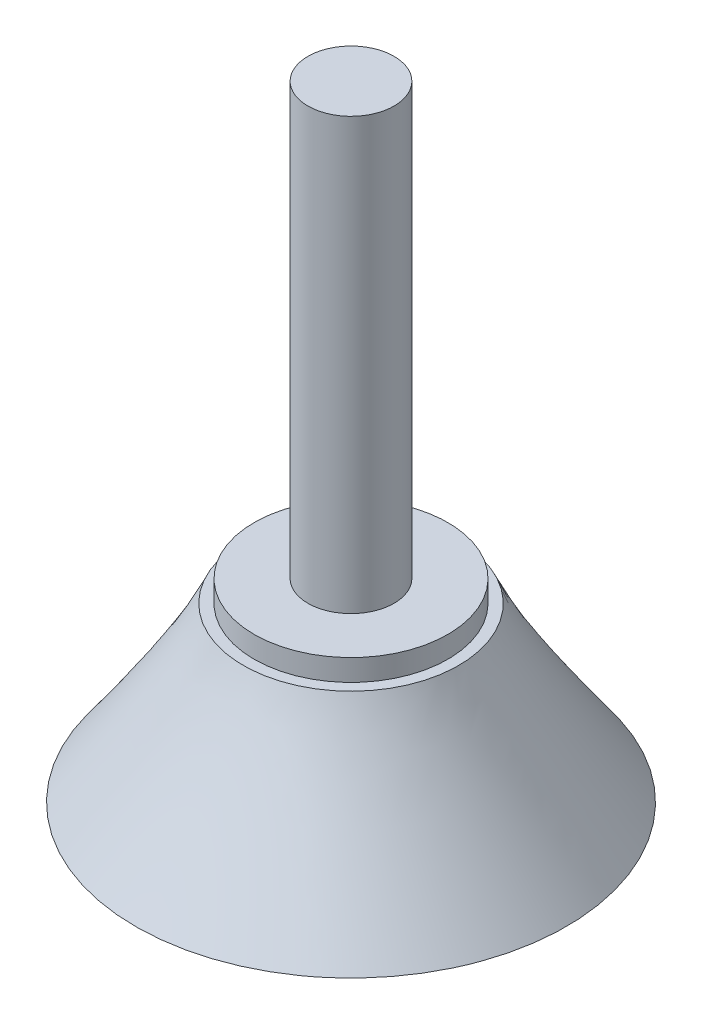
ISO-10303-21;
HEADER;
FILE_DESCRIPTION(('STEP AP214'),'2;1');
FILE_NAME('part.step','',(''),(''),'','','');
FILE_SCHEMA(('AUTOMOTIVE_DESIGN { 1 0 10303 214 1 1 1 1 }'));
ENDSEC;
DATA;
#1=APPLICATION_CONTEXT('core data for automotive mechanical design processes');
#2=APPLICATION_PROTOCOL_DEFINITION('international standard','automotive_design',2000,#1);
#3=PRODUCT_CONTEXT('',#1,'mechanical');
#4=PRODUCT('Part','Part','',(#3));
#5=PRODUCT_RELATED_PRODUCT_CATEGORY('part','',(#4));
#6=PRODUCT_DEFINITION_FORMATION('','',#4);
#7=PRODUCT_DEFINITION_CONTEXT('part definition',#1,'design');
#8=PRODUCT_DEFINITION('design','',#6,#7);
#9=PRODUCT_DEFINITION_SHAPE('','',#8);
#10=(LENGTH_UNIT() NAMED_UNIT(*) SI_UNIT(.MILLI.,.METRE.));
#11=(NAMED_UNIT(*) PLANE_ANGLE_UNIT() SI_UNIT($,.RADIAN.));
#12=(NAMED_UNIT(*) SI_UNIT($,.STERADIAN.) SOLID_ANGLE_UNIT());
#13=UNCERTAINTY_MEASURE_WITH_UNIT(LENGTH_MEASURE(1.E-05),#10,'distance_accuracy_value','');
#14=(GEOMETRIC_REPRESENTATION_CONTEXT(3) GLOBAL_UNCERTAINTY_ASSIGNED_CONTEXT((#13)) GLOBAL_UNIT_ASSIGNED_CONTEXT((#10,
#11,#12)) REPRESENTATION_CONTEXT('',''));
#15=CARTESIAN_POINT('',(0.,0.,0.));
#16=DIRECTION('',(0.,0.,1.));
#17=DIRECTION('',(1.,0.,0.));
#18=AXIS2_PLACEMENT_3D('',#15,#16,#17);
#19=CARTESIAN_POINT('',(0.,40.,0.));
#20=DIRECTION('',(0.,1.,0.));
#21=DIRECTION('',(0.,0.,1.));
#22=AXIS2_PLACEMENT_3D('',#19,#20,#21);
#23=PLANE('',#22);
#24=CARTESIAN_POINT('',(0.,40.,0.));
#25=DIRECTION('',(0.,1.,0.));
#26=DIRECTION('',(0.,0.,1.));
#27=AXIS2_PLACEMENT_3D('',#24,#25,#26);
#28=CIRCLE('',#27,22.5);
#29=CARTESIAN_POINT('',(0.,40.,22.5));
#30=VERTEX_POINT('',#29);
#31=EDGE_CURVE('E53',#30,#30,#28,.T.);
#32=ORIENTED_EDGE('',*,*,#31,.F.);
#33=EDGE_LOOP('',(#32));
#34=FACE_BOUND('',#33,.T.);
#35=CARTESIAN_POINT('',(0.,40.,0.));
#36=DIRECTION('',(0.,1.,0.));
#37=DIRECTION('',(0.,0.,1.));
#38=AXIS2_PLACEMENT_3D('',#35,#36,#37);
#39=CIRCLE('',#38,25.);
#40=CARTESIAN_POINT('',(-24.8845701518174,40.,-2.39961837784195));
#41=VERTEX_POINT('',#40);
#42=EDGE_CURVE('E59',#41,#41,#39,.T.);
#43=ORIENTED_EDGE('',*,*,#42,.T.);
#44=EDGE_LOOP('',(#43));
#45=FACE_BOUND('',#44,.T.);
#46=ADVANCED_FACE('F44',(#34,#45),#23,.T.);
#47=CARTESIAN_POINT('',(0.,0.,0.));
#48=DIRECTION('',(0.,1.,0.));
#49=DIRECTION('',(0.,0.,1.));
#50=AXIS2_PLACEMENT_3D('',#47,#48,#49);
#51=PLANE('',#50);
#52=CARTESIAN_POINT('',(0.,0.,0.));
#53=DIRECTION('',(0.,1.,0.));
#54=DIRECTION('',(0.,0.,1.));
#55=AXIS2_PLACEMENT_3D('',#52,#53,#54);
#56=CIRCLE('',#55,50.);
#57=CARTESIAN_POINT('',(-39.8138297133582,0.,-30.2466355741546));
#58=VERTEX_POINT('',#57);
#59=EDGE_CURVE('E67',#58,#58,#56,.T.);
#60=ORIENTED_EDGE('',*,*,#59,.F.);
#61=EDGE_LOOP('',(#60));
#62=FACE_BOUND('',#61,.T.);
#63=ADVANCED_FACE('F90',(#62),#51,.F.);
#64=CARTESIAN_POINT('',(-39.8138297133582,0.,-30.2466355741546));
#65=CARTESIAN_POINT('',(-24.8845701518174,40.,-2.39961837784195));
#66=CARTESIAN_POINT('',(-100.307100861667,0.,49.3810238525618));
#67=CARTESIAN_POINT('',(-29.6838069075013,40.,47.369521925793));
#68=CARTESIAN_POINT('',(-20.679441434951,0.,109.874295000871));
#69=CARTESIAN_POINT('',(20.0853333961336,40.,52.1687586814768));
#70=CARTESIAN_POINT('',(39.8138297133582,0.,30.2466355741546));
#71=CARTESIAN_POINT('',(24.8845701518174,40.,2.39961837784193));
#72=CARTESIAN_POINT('',(100.307100861667,0.,-49.3810238525618));
#73=CARTESIAN_POINT('',(29.6838069075013,40.,-47.3695219257929));
#74=CARTESIAN_POINT('',(20.6794414349511,0.,-109.874295000871));
#75=CARTESIAN_POINT('',(-20.0853333961336,40.,-52.1687586814768));
#76=CARTESIAN_POINT('',(-39.8138297133582,0.,-30.2466355741546));
#77=CARTESIAN_POINT('',(-24.8845701518174,40.,-2.39961837784195));
#78=(BOUNDED_SURFACE() B_SPLINE_SURFACE(3,1,((#64,#65),(#66,#67),(#68,#69),(#70,#71),(#72,#73),
(#74,#75),(#76,#77)),.UNSPECIFIED.,.T.,.F.,.F.) B_SPLINE_SURFACE_WITH_KNOTS((4,3,4),(2,2),(0.,
0.5,1.),(0.,1.),.UNSPECIFIED.) GEOMETRIC_REPRESENTATION_ITEM() RATIONAL_B_SPLINE_SURFACE(((1.,
1.),(0.333333333333333,0.333333333333333),(0.333333333333333,0.333333333333333),(1.,1.),
(0.333333333333333,0.333333333333333),(0.333333333333333,0.333333333333333),(1.,1.))) REPRESENTATION_ITEM('') SURFACE());
#79=CARTESIAN_POINT('',(-39.8138297133582,0.,-30.2466355741546));
#80=CARTESIAN_POINT('',(-39.6583165929255,0.416666666666667,-29.9565624783597));
#81=CARTESIAN_POINT('',(-39.5028034724928,0.833333333333334,-29.6664893825648));
#82=CARTESIAN_POINT('',(-39.1917772316273,1.66666666666667,-29.0863431909749));
#83=CARTESIAN_POINT('',(-39.0362641111946,2.08333333333333,-28.79627009518));
#84=CARTESIAN_POINT('',(-38.7252378703292,2.91666666666667,-28.2161239035902));
#85=CARTESIAN_POINT('',(-38.5697247498965,3.33333333333333,-27.9260508077952));
#86=CARTESIAN_POINT('',(-38.258698509031,4.16666666666667,-27.3459046162054));
#87=CARTESIAN_POINT('',(-38.1031853885983,4.58333333333333,-27.0558315204105));
#88=CARTESIAN_POINT('',(-37.7921591477329,5.41666666666667,-26.4756853288206));
#89=CARTESIAN_POINT('',(-37.6366460273002,5.83333333333333,-26.1856122330257));
#90=CARTESIAN_POINT('',(-37.3256197864347,6.66666666666667,-25.6054660414359));
#91=CARTESIAN_POINT('',(-37.170106666002,7.08333333333333,-25.3153929456409));
#92=CARTESIAN_POINT('',(-36.8590804251366,7.91666666666667,-24.7352467540511));
#93=CARTESIAN_POINT('',(-36.7035673047039,8.33333333333333,-24.4451736582562));
#94=CARTESIAN_POINT('',(-36.3925410638384,9.16666666666667,-23.8650274666663));
#95=CARTESIAN_POINT('',(-36.2370279434057,9.58333333333333,-23.5749543708714));
#96=CARTESIAN_POINT('',(-35.9260017025403,10.4166666666667,-22.9948081792815));
#97=CARTESIAN_POINT('',(-35.7704885821076,10.8333333333333,-22.7047350834866));
#98=CARTESIAN_POINT('',(-35.4594623412421,11.6666666666667,-22.1245888918968));
#99=CARTESIAN_POINT('',(-35.3039492208094,12.0833333333333,-21.8345157961018));
#100=CARTESIAN_POINT('',(-34.992922979944,12.9166666666667,-21.254369604512));
#101=CARTESIAN_POINT('',(-34.8374098595113,13.3333333333333,-20.9642965087171));
#102=CARTESIAN_POINT('',(-34.5263836186459,14.1666666666667,-20.3841503171272));
#103=CARTESIAN_POINT('',(-34.3708704982131,14.5833333333333,-20.0940772213323));
#104=CARTESIAN_POINT('',(-34.0598442573477,15.4166666666667,-19.5139310297425));
#105=CARTESIAN_POINT('',(-33.904331136915,15.8333333333333,-19.2238579339475));
#106=CARTESIAN_POINT('',(-33.5933048960495,16.6666666666667,-18.6437117423577));
#107=CARTESIAN_POINT('',(-33.4377917756168,17.0833333333333,-18.3536386465628));
#108=CARTESIAN_POINT('',(-33.1267655347514,17.9166666666667,-17.7734924549729));
#109=CARTESIAN_POINT('',(-32.9712524143187,18.3333333333333,-17.483419359178));
#110=CARTESIAN_POINT('',(-32.6602261734533,19.1666666666667,-16.9032731675881));
#111=CARTESIAN_POINT('',(-32.5047130530205,19.5833333333333,-16.6132000717932));
#112=CARTESIAN_POINT('',(-32.1936868121551,20.4166666666667,-16.0330538802034));
#113=CARTESIAN_POINT('',(-32.0381736917224,20.8333333333333,-15.7429807844084));
#114=CARTESIAN_POINT('',(-31.727147450857,21.6666666666667,-15.1628345928186));
#115=CARTESIAN_POINT('',(-31.5716343304242,22.0833333333333,-14.8727614970237));
#116=CARTESIAN_POINT('',(-31.2606080895588,22.9166666666667,-14.2926153054338));
#117=CARTESIAN_POINT('',(-31.1050949691261,23.3333333333333,-14.0025422096389));
#118=CARTESIAN_POINT('',(-30.7940687282607,24.1666666666667,-13.4223960180491));
#119=CARTESIAN_POINT('',(-30.6385556078279,24.5833333333333,-13.1323229222541));
#120=CARTESIAN_POINT('',(-30.3275293669625,25.4166666666667,-12.5521767306643));
#121=CARTESIAN_POINT('',(-30.1720162465298,25.8333333333333,-12.2621036348694));
#122=CARTESIAN_POINT('',(-29.8609900056644,26.6666666666667,-11.6819574432795));
#123=CARTESIAN_POINT('',(-29.7054768852316,27.0833333333333,-11.3918843474846));
#124=CARTESIAN_POINT('',(-29.3944506443662,27.9166666666667,-10.8117381558947));
#125=CARTESIAN_POINT('',(-29.2389375239335,28.3333333333333,-10.5216650600998));
#126=CARTESIAN_POINT('',(-28.9279112830681,29.1666666666667,-9.94151886850997));
#127=CARTESIAN_POINT('',(-28.7723981626353,29.5833333333333,-9.65144577271504));
#128=CARTESIAN_POINT('',(-28.4613719217699,30.4166666666667,-9.0712995811252));
#129=CARTESIAN_POINT('',(-28.3058588013372,30.8333333333333,-8.78122648533027));
#130=CARTESIAN_POINT('',(-27.9948325604718,31.6666666666667,-8.20108029374043));
#131=CARTESIAN_POINT('',(-27.839319440039,32.0833333333333,-7.9110071979455));
#132=CARTESIAN_POINT('',(-27.5282931991736,32.9166666666667,-7.33086100635566));
#133=CARTESIAN_POINT('',(-27.3727800787409,33.3333333333333,-7.04078791056073));
#134=CARTESIAN_POINT('',(-27.0617538378755,34.1666666666667,-6.46064171897088));
#135=CARTESIAN_POINT('',(-26.9062407174427,34.5833333333333,-6.17056862317596));
#136=CARTESIAN_POINT('',(-26.5952144765773,35.4166666666667,-5.59042243158611));
#137=CARTESIAN_POINT('',(-26.4397013561446,35.8333333333333,-5.30034933579119));
#138=CARTESIAN_POINT('',(-26.1286751152792,36.6666666666667,-4.72020314420134));
#139=CARTESIAN_POINT('',(-25.9731619948464,37.0833333333333,-4.43013004840642));
#140=CARTESIAN_POINT('',(-25.662135753981,37.9166666666667,-3.84998385681657));
#141=CARTESIAN_POINT('',(-25.5066226335483,38.3333333333333,-3.55991076102165));
#142=CARTESIAN_POINT('',(-25.1955963926829,39.1666666666667,-2.9797645694318));
#143=CARTESIAN_POINT('',(-25.0400832722502,39.5833333333333,-2.68969147363688));
#144=CARTESIAN_POINT('',(-24.8845701518174,40.,-2.39961837784195));
#145=B_SPLINE_CURVE_WITH_KNOTS('',3,(#79,#80,#81,#82,#83,#84,#85,#86,#87,#88,#89,#90,#91,#92,
#93,#94,#95,#96,#97,#98,#99,#100,#101,#102,#103,#104,#105,#106,#107,#108,#109,#110,#111,#112,
#113,#114,#115,#116,#117,#118,#119,#120,#121,#122,#123,#124,#125,#126,#127,#128,#129,#130,#131,
#132,#133,#134,#135,#136,#137,#138,#139,#140,#141,#142,#143,#144),.UNSPECIFIED.,.F.,.F.,(4,2,2,
2,2,2,2,2,2,2,2,2,2,2,2,2,2,2,2,2,2,2,2,2,2,2,2,2,2,2,2,2,4),(0.,1.59293458239092,
3.18586916478185,4.77880374717277,6.37173832956369,7.96467291195462,9.55760749434554,
11.1505420767365,12.7434766591274,14.3364112415183,15.9293458239092,17.5222804063002,
19.1152149886911,20.708149571082,22.3010841534729,23.8940187358638,25.4869533182548,
27.0798879006457,28.6728224830366,30.2657570654275,31.8586916478185,33.4516262302094,
35.0445608126003,36.6374953949912,38.2304299773822,39.8233645597731,41.416299142164,
43.0092337245549,44.6021683069459,46.1951028893368,47.7880374717277,49.3809720541186,
50.9739066365095),.UNSPECIFIED.);
#146=EDGE_CURVE('BSEAM78',#58,#41,#145,.T.);
#147=ORIENTED_EDGE('',*,*,#59,.T.);
#148=ORIENTED_EDGE('',*,*,#42,.F.);
#149=ORIENTED_EDGE('',*,*,#146,.T.);
#150=ORIENTED_EDGE('',*,*,#146,.F.);
#151=EDGE_LOOP('',(#147,#149,#148,#150));
#152=FACE_BOUND('',#151,.T.);
#153=ADVANCED_FACE('F78',(#152),#78,.T.);
#154=CARTESIAN_POINT('',(0.,45.,0.));
#155=DIRECTION('',(0.,-1.,0.));
#156=DIRECTION('',(0.,0.,-1.));
#157=AXIS2_PLACEMENT_3D('',#154,#155,#156);
#158=CYLINDRICAL_SURFACE('',#157,22.5);
#159=CARTESIAN_POINT('',(0.,45.,0.));
#160=DIRECTION('',(0.,1.,0.));
#161=DIRECTION('',(0.,0.,1.));
#162=AXIS2_PLACEMENT_3D('',#159,#160,#161);
#163=CIRCLE('',#162,22.5);
#164=CARTESIAN_POINT('',(0.,45.,22.5));
#165=VERTEX_POINT('',#164);
#166=EDGE_CURVE('E64',#165,#165,#163,.T.);
#167=ORIENTED_EDGE('',*,*,#166,.F.);
#168=EDGE_LOOP('',(#167));
#169=FACE_BOUND('',#168,.T.);
#170=ORIENTED_EDGE('',*,*,#31,.T.);
#171=EDGE_LOOP('',(#170));
#172=FACE_BOUND('',#171,.T.);
#173=ADVANCED_FACE('F89',(#169,#172),#158,.T.);
#174=CARTESIAN_POINT('',(0.,45.,0.));
#175=DIRECTION('',(0.,1.,0.));
#176=DIRECTION('',(0.,0.,1.));
#177=AXIS2_PLACEMENT_3D('',#174,#175,#176);
#178=PLANE('',#177);
#179=CARTESIAN_POINT('',(0.,45.,0.));
#180=DIRECTION('',(0.,1.,0.));
#181=DIRECTION('',(0.,0.,1.));
#182=AXIS2_PLACEMENT_3D('',#179,#180,#181);
#183=CIRCLE('',#182,10.);
#184=CARTESIAN_POINT('',(0.,45.,10.));
#185=VERTEX_POINT('',#184);
#186=EDGE_CURVE('E11',#185,#185,#183,.T.);
#187=ORIENTED_EDGE('',*,*,#186,.F.);
#188=EDGE_LOOP('',(#187));
#189=FACE_BOUND('',#188,.T.);
#190=ORIENTED_EDGE('',*,*,#166,.T.);
#191=EDGE_LOOP('',(#190));
#192=FACE_BOUND('',#191,.T.);
#193=ADVANCED_FACE('F140',(#189,#192),#178,.T.);
#194=CARTESIAN_POINT('',(0.,145.,0.));
#195=DIRECTION('',(0.,-1.,0.));
#196=DIRECTION('',(0.,0.,-1.));
#197=AXIS2_PLACEMENT_3D('',#194,#195,#196);
#198=CYLINDRICAL_SURFACE('',#197,10.);
#199=CARTESIAN_POINT('',(0.,145.,0.));
#200=DIRECTION('',(0.,1.,0.));
#201=DIRECTION('',(0.,0.,1.));
#202=AXIS2_PLACEMENT_3D('',#199,#200,#201);
#203=CIRCLE('',#202,10.);
#204=CARTESIAN_POINT('',(0.,145.,10.));
#205=VERTEX_POINT('',#204);
#206=EDGE_CURVE('E63',#205,#205,#203,.T.);
#207=ORIENTED_EDGE('',*,*,#206,.F.);
#208=EDGE_LOOP('',(#207));
#209=FACE_BOUND('',#208,.T.);
#210=ORIENTED_EDGE('',*,*,#186,.T.);
#211=EDGE_LOOP('',(#210));
#212=FACE_BOUND('',#211,.T.);
#213=ADVANCED_FACE('F138',(#209,#212),#198,.T.);
#214=CARTESIAN_POINT('',(0.,145.,0.));
#215=DIRECTION('',(0.,1.,0.));
#216=DIRECTION('',(0.,0.,1.));
#217=AXIS2_PLACEMENT_3D('',#214,#215,#216);
#218=PLANE('',#217);
#219=ORIENTED_EDGE('',*,*,#206,.T.);
#220=EDGE_LOOP('',(#219));
#221=FACE_BOUND('',#220,.T.);
#222=ADVANCED_FACE('F136',(#221),#218,.T.);
#223=CLOSED_SHELL('',(#46,#63,#153,#173,#193,#213,#222));
#224=MANIFOLD_SOLID_BREP('B2',#223);
#225=ADVANCED_BREP_SHAPE_REPRESENTATION('',(#18,#224),#14);
#226=SHAPE_DEFINITION_REPRESENTATION(#9,#225);
ENDSEC;
END-ISO-10303-21;
